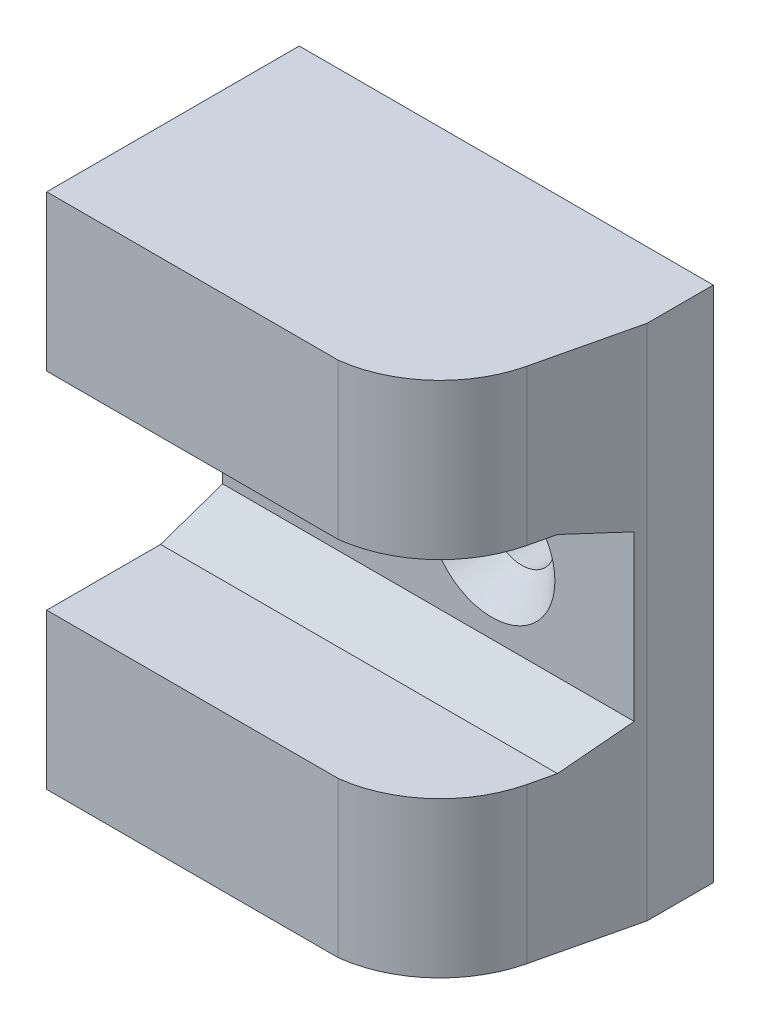
ISO-10303-21;
HEADER;
FILE_DESCRIPTION(('STEP AP214'),'2;1');
FILE_NAME('part.step','',(''),(''),'','','');
FILE_SCHEMA(('AUTOMOTIVE_DESIGN { 1 0 10303 214 1 1 1 1 }'));
ENDSEC;
DATA;
#1=APPLICATION_CONTEXT('core data for automotive mechanical design processes');
#2=APPLICATION_PROTOCOL_DEFINITION('international standard','automotive_design',2000,#1);
#3=PRODUCT_CONTEXT('',#1,'mechanical');
#4=PRODUCT('Part','Part','',(#3));
#5=PRODUCT_RELATED_PRODUCT_CATEGORY('part','',(#4));
#6=PRODUCT_DEFINITION_FORMATION('','',#4);
#7=PRODUCT_DEFINITION_CONTEXT('part definition',#1,'design');
#8=PRODUCT_DEFINITION('design','',#6,#7);
#9=PRODUCT_DEFINITION_SHAPE('','',#8);
#10=(LENGTH_UNIT() NAMED_UNIT(*) SI_UNIT(.MILLI.,.METRE.));
#11=(NAMED_UNIT(*) PLANE_ANGLE_UNIT() SI_UNIT($,.RADIAN.));
#12=(NAMED_UNIT(*) SI_UNIT($,.STERADIAN.) SOLID_ANGLE_UNIT());
#13=UNCERTAINTY_MEASURE_WITH_UNIT(LENGTH_MEASURE(1.E-05),#10,'distance_accuracy_value','');
#14=(GEOMETRIC_REPRESENTATION_CONTEXT(3) GLOBAL_UNCERTAINTY_ASSIGNED_CONTEXT((#13)) GLOBAL_UNIT_ASSIGNED_CONTEXT((#10,
#11,#12)) REPRESENTATION_CONTEXT('',''));
#15=CARTESIAN_POINT('',(0.,0.,0.));
#16=DIRECTION('',(0.,0.,1.));
#17=DIRECTION('',(1.,0.,0.));
#18=AXIS2_PLACEMENT_3D('',#15,#16,#17);
#19=CARTESIAN_POINT('',(0.,0.,12.2));
#20=DIRECTION('',(0.,0.,1.));
#21=DIRECTION('',(1.,0.,0.));
#22=AXIS2_PLACEMENT_3D('',#19,#20,#21);
#23=PLANE('',#22);
#24=DIRECTION('',(1.,0.,0.));
#25=VECTOR('',#24,1.);
#26=CARTESIAN_POINT('',(107.,87.4999999999999,12.2));
#27=LINE('',#26,#25);
#28=CARTESIAN_POINT('',(107.,87.4999999999999,12.2));
#29=VERTEX_POINT('',#28);
#30=CARTESIAN_POINT('',(121.083012975501,87.4999999999999,12.2));
#31=VERTEX_POINT('',#30);
#32=EDGE_CURVE('E153',#29,#31,#27,.T.);
#33=ORIENTED_EDGE('',*,*,#32,.F.);
#34=DIRECTION('',(0.,-1.,0.));
#35=VECTOR('',#34,1.);
#36=CARTESIAN_POINT('',(107.,79.9999999999999,12.2));
#37=LINE('',#36,#35);
#38=CARTESIAN_POINT('',(107.,79.9999999999999,12.2));
#39=VERTEX_POINT('',#38);
#40=EDGE_CURVE('E161',#29,#39,#37,.T.);
#41=ORIENTED_EDGE('',*,*,#40,.T.);
#42=DIRECTION('',(1.,0.,0.));
#43=VECTOR('',#42,1.);
#44=CARTESIAN_POINT('',(127.,79.9999999999999,12.2));
#45=LINE('',#44,#43);
#46=CARTESIAN_POINT('',(121.083012975501,79.9999999999999,12.2));
#47=VERTEX_POINT('',#46);
#48=EDGE_CURVE('E160',#39,#47,#45,.T.);
#49=ORIENTED_EDGE('',*,*,#48,.T.);
#50=DIRECTION('',(0.,1.,0.));
#51=VECTOR('',#50,1.);
#52=CARTESIAN_POINT('',(121.083012975501,78.5000000000001,12.2));
#53=LINE('',#52,#51);
#54=EDGE_CURVE('E188',#31,#47,#53,.F.);
#55=ORIENTED_EDGE('',*,*,#54,.F.);
#56=EDGE_LOOP('',(#33,#41,#49,#55));
#57=FACE_BOUND('',#56,.T.);
#58=ADVANCED_FACE('F37',(#57),#23,.T.);
#59=CARTESIAN_POINT('',(120.4,78.5000000000001,6.6));
#60=DIRECTION('',(0.,1.,0.));
#61=DIRECTION('',(-1.,0.,0.));
#62=AXIS2_PLACEMENT_3D('',#59,#60,#61);
#63=CYLINDRICAL_SURFACE('',#62,5.6414986240097);
#64=DIRECTION('',(0.,1.,0.));
#65=VECTOR('',#64,1.);
#66=CARTESIAN_POINT('',(125.890619014075,78.5000000000001,7.89599751812158));
#67=LINE('',#66,#65);
#68=CARTESIAN_POINT('',(125.890619014075,79.9999999999999,7.89599751812158));
#69=VERTEX_POINT('',#68);
#70=CARTESIAN_POINT('',(125.890619014075,87.4999999999999,7.89599751812158));
#71=VERTEX_POINT('',#70);
#72=EDGE_CURVE('E233',#69,#71,#67,.T.);
#73=ORIENTED_EDGE('',*,*,#72,.T.);
#74=CARTESIAN_POINT('',(120.4,87.4999999999999,6.6));
#75=DIRECTION('',(0.,-1.,0.));
#76=DIRECTION('',(0.,0.,-1.));
#77=AXIS2_PLACEMENT_3D('',#74,#75,#76);
#78=CIRCLE('',#77,5.6414986240097);
#79=EDGE_CURVE('E195',#71,#31,#78,.T.);
#80=ORIENTED_EDGE('',*,*,#79,.T.);
#81=ORIENTED_EDGE('',*,*,#54,.T.);
#82=CARTESIAN_POINT('',(120.4,79.9999999999999,6.6));
#83=DIRECTION('',(0.,1.,0.));
#84=DIRECTION('',(0.,0.,1.));
#85=AXIS2_PLACEMENT_3D('',#82,#83,#84);
#86=CIRCLE('',#85,5.6414986240097);
#87=EDGE_CURVE('E173',#69,#47,#86,.F.);
#88=ORIENTED_EDGE('',*,*,#87,.F.);
#89=EDGE_LOOP('',(#73,#80,#81,#88));
#90=FACE_BOUND('',#89,.T.);
#91=ADVANCED_FACE('F311',(#90),#63,.T.);
#92=CARTESIAN_POINT('',(127.,79.9999999999999,12.2));
#93=DIRECTION('',(-1.,0.,0.));
#94=DIRECTION('',(0.,0.,1.));
#95=AXIS2_PLACEMENT_3D('',#92,#93,#94);
#96=PLANE('',#95);
#97=DIRECTION('',(0.,0.,-1.));
#98=VECTOR('',#97,1.);
#99=CARTESIAN_POINT('',(127.,105.,12.2));
#100=LINE('',#99,#98);
#101=CARTESIAN_POINT('',(127.,105.,3.19599751812158));
#102=VERTEX_POINT('',#101);
#103=CARTESIAN_POINT('',(127.,105.,0.));
#104=VERTEX_POINT('',#103);
#105=EDGE_CURVE('E186',#102,#104,#100,.T.);
#106=ORIENTED_EDGE('',*,*,#105,.F.);
#107=DIRECTION('',(0.,1.,0.));
#108=VECTOR('',#107,1.);
#109=CARTESIAN_POINT('',(127.,78.5000000000001,3.19599751812158));
#110=LINE('',#109,#108);
#111=CARTESIAN_POINT('',(127.,79.9999999999999,3.19599751812158));
#112=VERTEX_POINT('',#111);
#113=EDGE_CURVE('E234',#112,#102,#110,.T.);
#114=ORIENTED_EDGE('',*,*,#113,.F.);
#115=DIRECTION('',(0.,0.,-1.));
#116=VECTOR('',#115,1.);
#117=CARTESIAN_POINT('',(127.,79.9999999999999,12.2));
#118=LINE('',#117,#116);
#119=CARTESIAN_POINT('',(127.,79.9999999999999,0.));
#120=VERTEX_POINT('',#119);
#121=EDGE_CURVE('E164',#112,#120,#118,.T.);
#122=ORIENTED_EDGE('',*,*,#121,.T.);
#123=DIRECTION('',(0.,1.,0.));
#124=VECTOR('',#123,1.);
#125=CARTESIAN_POINT('',(127.,79.9999999999999,0.));
#126=LINE('',#125,#124);
#127=EDGE_CURVE('E169',#120,#104,#126,.T.);
#128=ORIENTED_EDGE('',*,*,#127,.T.);
#129=EDGE_LOOP('',(#106,#114,#122,#128));
#130=FACE_BOUND('',#129,.T.);
#131=ADVANCED_FACE('F259',(#130),#96,.F.);
#132=CARTESIAN_POINT('',(127.,105.,12.2));
#133=DIRECTION('',(0.,-1.,0.));
#134=DIRECTION('',(1.,0.,0.));
#135=AXIS2_PLACEMENT_3D('',#132,#133,#134);
#136=PLANE('',#135);
#137=DIRECTION('',(-1.,0.,0.));
#138=VECTOR('',#137,1.);
#139=CARTESIAN_POINT('',(127.,105.,12.2));
#140=LINE('',#139,#138);
#141=CARTESIAN_POINT('',(121.083012975501,105.,12.2));
#142=VERTEX_POINT('',#141);
#143=CARTESIAN_POINT('',(107.,105.,12.2));
#144=VERTEX_POINT('',#143);
#145=EDGE_CURVE('E158',#142,#144,#140,.T.);
#146=ORIENTED_EDGE('',*,*,#145,.F.);
#147=CARTESIAN_POINT('',(120.4,105.,6.6));
#148=DIRECTION('',(0.,-1.,0.));
#149=DIRECTION('',(-1.,0.,0.));
#150=AXIS2_PLACEMENT_3D('',#147,#148,#149);
#151=CIRCLE('',#150,5.6414986240097);
#152=CARTESIAN_POINT('',(125.890619014075,105.,7.89599751812158));
#153=VERTEX_POINT('',#152);
#154=EDGE_CURVE('E263',#153,#142,#151,.T.);
#155=ORIENTED_EDGE('',*,*,#154,.F.);
#156=DIRECTION('',(-0.229725752764686,0.,0.973255402510923));
#157=VECTOR('',#156,1.);
#158=CARTESIAN_POINT('',(125.890619014075,105.,7.89599751812158));
#159=LINE('',#158,#157);
#160=EDGE_CURVE('E231',#102,#153,#159,.T.);
#161=ORIENTED_EDGE('',*,*,#160,.F.);
#162=ORIENTED_EDGE('',*,*,#105,.T.);
#163=DIRECTION('',(-1.,0.,0.));
#164=VECTOR('',#163,1.);
#165=CARTESIAN_POINT('',(127.,105.,0.));
#166=LINE('',#165,#164);
#167=CARTESIAN_POINT('',(107.,105.,0.));
#168=VERTEX_POINT('',#167);
#169=EDGE_CURVE('E172',#104,#168,#166,.T.);
#170=ORIENTED_EDGE('',*,*,#169,.T.);
#171=DIRECTION('',(0.,0.,-1.));
#172=VECTOR('',#171,1.);
#173=CARTESIAN_POINT('',(107.,105.,12.2));
#174=LINE('',#173,#172);
#175=EDGE_CURVE('E184',#144,#168,#174,.T.);
#176=ORIENTED_EDGE('',*,*,#175,.F.);
#177=EDGE_LOOP('',(#146,#155,#161,#162,#170,#176));
#178=FACE_BOUND('',#177,.T.);
#179=ADVANCED_FACE('F262',(#178),#136,.F.);
#180=CARTESIAN_POINT('',(107.,79.9999999999999,12.2));
#181=DIRECTION('',(1.,0.,0.));
#182=DIRECTION('',(0.,0.,-1.));
#183=AXIS2_PLACEMENT_3D('',#180,#181,#182);
#184=PLANE('',#183);
#185=ORIENTED_EDGE('',*,*,#40,.F.);
#186=DIRECTION('',(0.,0.,1.));
#187=VECTOR('',#186,1.);
#188=CARTESIAN_POINT('',(107.,87.4999999999999,3.7));
#189=LINE('',#188,#187);
#190=CARTESIAN_POINT('',(107.,87.4999999999999,6.69999999999996));
#191=VERTEX_POINT('',#190);
#192=EDGE_CURVE('E142',#191,#29,#189,.T.);
#193=ORIENTED_EDGE('',*,*,#192,.F.);
#194=DIRECTION('',(0.,0.32556815445716,-0.945518575599316));
#195=VECTOR('',#194,1.);
#196=CARTESIAN_POINT('',(107.,85.0119712688795,13.9257601048897));
#197=LINE('',#196,#195);
#198=CARTESIAN_POINT('',(107.,88.5329828398689,3.7));
#199=VERTEX_POINT('',#198);
#200=EDGE_CURVE('E11',#191,#199,#197,.T.);
#201=ORIENTED_EDGE('',*,*,#200,.T.);
#202=DIRECTION('',(0.,-1.,0.));
#203=VECTOR('',#202,1.);
#204=CARTESIAN_POINT('',(107.,97.4999999999999,3.7));
#205=LINE('',#204,#203);
#206=CARTESIAN_POINT('',(107.,96.4670171601309,3.7));
#207=VERTEX_POINT('',#206);
#208=EDGE_CURVE('E143',#207,#199,#205,.T.);
#209=ORIENTED_EDGE('',*,*,#208,.F.);
#210=DIRECTION('',(0.,0.32556815445716,0.945518575599316));
#211=VECTOR('',#210,1.);
#212=CARTESIAN_POINT('',(107.,97.3381631512042,6.2299916633189));
#213=LINE('',#212,#211);
#214=CARTESIAN_POINT('',(107.,97.4999999999999,6.69999999999996));
#215=VERTEX_POINT('',#214);
#216=EDGE_CURVE('E139',#207,#215,#213,.T.);
#217=ORIENTED_EDGE('',*,*,#216,.T.);
#218=DIRECTION('',(0.,0.,1.));
#219=VECTOR('',#218,1.);
#220=CARTESIAN_POINT('',(107.,97.4999999999999,3.7));
#221=LINE('',#220,#219);
#222=CARTESIAN_POINT('',(107.,97.4999999999999,12.2));
#223=VERTEX_POINT('',#222);
#224=EDGE_CURVE('E131',#215,#223,#221,.T.);
#225=ORIENTED_EDGE('',*,*,#224,.T.);
#226=EDGE_CURVE('E137',#144,#223,#37,.T.);
#227=ORIENTED_EDGE('',*,*,#226,.F.);
#228=ORIENTED_EDGE('',*,*,#175,.T.);
#229=DIRECTION('',(0.,-1.,0.));
#230=VECTOR('',#229,1.);
#231=CARTESIAN_POINT('',(107.,79.9999999999999,0.));
#232=LINE('',#231,#230);
#233=CARTESIAN_POINT('',(107.,79.9999999999999,0.));
#234=VERTEX_POINT('',#233);
#235=EDGE_CURVE('E175',#168,#234,#232,.T.);
#236=ORIENTED_EDGE('',*,*,#235,.T.);
#237=DIRECTION('',(0.,0.,-1.));
#238=VECTOR('',#237,1.);
#239=CARTESIAN_POINT('',(107.,79.9999999999999,12.2));
#240=LINE('',#239,#238);
#241=EDGE_CURVE('E181',#39,#234,#240,.T.);
#242=ORIENTED_EDGE('',*,*,#241,.F.);
#243=EDGE_LOOP('',(#185,#193,#201,#209,#217,#225,#227,#228,#236,#242));
#244=FACE_BOUND('',#243,.T.);
#245=ADVANCED_FACE('F134',(#244),#184,.F.);
#246=CARTESIAN_POINT('',(127.,79.9999999999999,12.2));
#247=DIRECTION('',(0.,1.,0.));
#248=DIRECTION('',(0.,0.,1.));
#249=AXIS2_PLACEMENT_3D('',#246,#247,#248);
#250=PLANE('',#249);
#251=DIRECTION('',(-0.229725752764686,0.,0.973255402510923));
#252=VECTOR('',#251,1.);
#253=CARTESIAN_POINT('',(124.98686864801,79.9999999999999,11.7248234799859));
#254=LINE('',#253,#252);
#255=EDGE_CURVE('E191',#112,#69,#254,.T.);
#256=ORIENTED_EDGE('',*,*,#255,.T.);
#257=ORIENTED_EDGE('',*,*,#87,.T.);
#258=ORIENTED_EDGE('',*,*,#48,.F.);
#259=ORIENTED_EDGE('',*,*,#241,.T.);
#260=DIRECTION('',(1.,0.,0.));
#261=VECTOR('',#260,1.);
#262=CARTESIAN_POINT('',(127.,79.9999999999999,0.));
#263=LINE('',#262,#261);
#264=EDGE_CURVE('E177',#234,#120,#263,.T.);
#265=ORIENTED_EDGE('',*,*,#264,.T.);
#266=ORIENTED_EDGE('',*,*,#121,.F.);
#267=EDGE_LOOP('',(#256,#257,#258,#259,#265,#266));
#268=FACE_BOUND('',#267,.T.);
#269=ADVANCED_FACE('F243',(#268),#250,.F.);
#270=DIRECTION('',(-1.,0.,0.));
#271=VECTOR('',#270,1.);
#272=CARTESIAN_POINT('',(107.,97.4999999999999,12.2));
#273=LINE('',#272,#271);
#274=CARTESIAN_POINT('',(121.083012975501,97.4999999999999,12.2));
#275=VERTEX_POINT('',#274);
#276=EDGE_CURVE('E146',#275,#223,#273,.T.);
#277=ORIENTED_EDGE('',*,*,#276,.F.);
#278=EDGE_CURVE('E189',#142,#275,#53,.F.);
#279=ORIENTED_EDGE('',*,*,#278,.F.);
#280=ORIENTED_EDGE('',*,*,#145,.T.);
#281=ORIENTED_EDGE('',*,*,#226,.T.);
#282=EDGE_LOOP('',(#277,#279,#280,#281));
#283=FACE_BOUND('',#282,.T.);
#284=ADVANCED_FACE('F156',(#283),#23,.T.);
#285=CARTESIAN_POINT('',(0.,0.,0.));
#286=DIRECTION('',(0.,0.,1.));
#287=DIRECTION('',(1.,0.,0.));
#288=AXIS2_PLACEMENT_3D('',#285,#286,#287);
#289=PLANE('',#288);
#290=CARTESIAN_POINT('',(112.,92.4999999999999,0.));
#291=DIRECTION('',(0.,0.,1.));
#292=DIRECTION('',(1.,0.,0.));
#293=AXIS2_PLACEMENT_3D('',#290,#291,#292);
#294=CIRCLE('',#293,1.6);
#295=CARTESIAN_POINT('',(113.6,92.4999999999999,0.));
#296=VERTEX_POINT('',#295);
#297=EDGE_CURVE('E277',#296,#296,#294,.T.);
#298=ORIENTED_EDGE('',*,*,#297,.T.);
#299=EDGE_LOOP('',(#298));
#300=FACE_BOUND('',#299,.T.);
#301=CARTESIAN_POINT('',(120.,92.4999999999999,0.));
#302=DIRECTION('',(0.,0.,1.));
#303=DIRECTION('',(1.,0.,0.));
#304=AXIS2_PLACEMENT_3D('',#301,#302,#303);
#305=CIRCLE('',#304,1.6);
#306=CARTESIAN_POINT('',(121.6,92.4999999999999,0.));
#307=VERTEX_POINT('',#306);
#308=EDGE_CURVE('E154',#307,#307,#305,.T.);
#309=ORIENTED_EDGE('',*,*,#308,.T.);
#310=EDGE_LOOP('',(#309));
#311=FACE_BOUND('',#310,.T.);
#312=ORIENTED_EDGE('',*,*,#127,.F.);
#313=ORIENTED_EDGE('',*,*,#264,.F.);
#314=ORIENTED_EDGE('',*,*,#235,.F.);
#315=ORIENTED_EDGE('',*,*,#169,.F.);
#316=EDGE_LOOP('',(#312,#313,#314,#315));
#317=FACE_BOUND('',#316,.T.);
#318=ADVANCED_FACE('F255',(#300,#311,#317),#289,.F.);
#319=CARTESIAN_POINT('',(125.890619014075,78.5000000000001,7.89599751812158));
#320=DIRECTION('',(-0.973255402510923,0.,-0.229725752764686));
#321=DIRECTION('',(-0.229725752764686,0.,0.973255402510923));
#322=AXIS2_PLACEMENT_3D('',#319,#320,#321);
#323=PLANE('',#322);
#324=DIRECTION('',(0.,1.,0.));
#325=VECTOR('',#324,1.);
#326=CARTESIAN_POINT('',(126.881036006329,78.5000000000001,3.7));
#327=LINE('',#326,#325);
#328=CARTESIAN_POINT('',(126.881036006329,88.5329828398689,3.7));
#329=VERTEX_POINT('',#328);
#330=CARTESIAN_POINT('',(126.881036006329,96.4670171601309,3.7));
#331=VERTEX_POINT('',#330);
#332=EDGE_CURVE('E198',#329,#331,#327,.T.);
#333=ORIENTED_EDGE('',*,*,#332,.F.);
#334=DIRECTION('',(-0.217820036497905,-0.317750921418551,0.922815682375258));
#335=VECTOR('',#334,1.);
#336=CARTESIAN_POINT('',(125.296209109169,86.2210733619439,10.4142726539915));
#337=LINE('',#336,#335);
#338=CARTESIAN_POINT('',(126.172920483398,87.4999999999999,6.69999999999996));
#339=VERTEX_POINT('',#338);
#340=EDGE_CURVE('E46',#329,#339,#337,.T.);
#341=ORIENTED_EDGE('',*,*,#340,.T.);
#342=DIRECTION('',(-0.229725752764686,0.,0.973255402510923));
#343=VECTOR('',#342,1.);
#344=CARTESIAN_POINT('',(125.890619014075,87.4999999999999,7.89599751812157));
#345=LINE('',#344,#343);
#346=EDGE_CURVE('E224',#339,#71,#345,.T.);
#347=ORIENTED_EDGE('',*,*,#346,.T.);
#348=ORIENTED_EDGE('',*,*,#72,.F.);
#349=ORIENTED_EDGE('',*,*,#255,.F.);
#350=ORIENTED_EDGE('',*,*,#113,.T.);
#351=ORIENTED_EDGE('',*,*,#160,.T.);
#352=CARTESIAN_POINT('',(125.890619014075,97.4999999999999,7.89599751812158));
#353=VERTEX_POINT('',#352);
#354=EDGE_CURVE('E228',#353,#153,#67,.T.);
#355=ORIENTED_EDGE('',*,*,#354,.F.);
#356=DIRECTION('',(0.229725752764686,0.,-0.973255402510923));
#357=VECTOR('',#356,1.);
#358=CARTESIAN_POINT('',(125.890619014075,97.4999999999999,7.89599751812156));
#359=LINE('',#358,#357);
#360=CARTESIAN_POINT('',(126.172920483398,97.4999999999999,6.69999999999996));
#361=VERTEX_POINT('',#360);
#362=EDGE_CURVE('E216',#353,#361,#359,.T.);
#363=ORIENTED_EDGE('',*,*,#362,.T.);
#364=DIRECTION('',(0.217820036497907,-0.31775092141855,-0.922815682375258));
#365=VECTOR('',#364,1.);
#366=CARTESIAN_POINT('',(127.234159593586,95.9518884923105,2.20395771951323));
#367=LINE('',#366,#365);
#368=EDGE_CURVE('E211',#361,#331,#367,.T.);
#369=ORIENTED_EDGE('',*,*,#368,.T.);
#370=EDGE_LOOP('',(#333,#341,#347,#348,#349,#350,#351,#355,#363,#369));
#371=FACE_BOUND('',#370,.T.);
#372=ADVANCED_FACE('F214',(#371),#323,.F.);
#373=ORIENTED_EDGE('',*,*,#278,.T.);
#374=CARTESIAN_POINT('',(120.4,97.4999999999999,6.6));
#375=DIRECTION('',(0.,1.,0.));
#376=DIRECTION('',(0.,0.,1.));
#377=AXIS2_PLACEMENT_3D('',#374,#375,#376);
#378=CIRCLE('',#377,5.6414986240097);
#379=EDGE_CURVE('E149',#275,#353,#378,.T.);
#380=ORIENTED_EDGE('',*,*,#379,.T.);
#381=ORIENTED_EDGE('',*,*,#354,.T.);
#382=ORIENTED_EDGE('',*,*,#154,.T.);
#383=EDGE_LOOP('',(#373,#380,#381,#382));
#384=FACE_BOUND('',#383,.T.);
#385=ADVANCED_FACE('F227',(#384),#63,.T.);
#386=CARTESIAN_POINT('',(0.,0.,3.7));
#387=DIRECTION('',(0.,0.,1.));
#388=DIRECTION('',(1.,0.,0.));
#389=AXIS2_PLACEMENT_3D('',#386,#387,#388);
#390=PLANE('',#389);
#391=CARTESIAN_POINT('',(112.,92.4999999999999,3.7));
#392=DIRECTION('',(0.,0.,1.));
#393=DIRECTION('',(1.,0.,0.));
#394=AXIS2_PLACEMENT_3D('',#391,#392,#393);
#395=CIRCLE('',#394,3.05);
#396=CARTESIAN_POINT('',(115.05,92.4999999999999,3.7));
#397=VERTEX_POINT('',#396);
#398=EDGE_CURVE('E283',#397,#397,#395,.T.);
#399=ORIENTED_EDGE('',*,*,#398,.F.);
#400=EDGE_LOOP('',(#399));
#401=FACE_BOUND('',#400,.T.);
#402=CARTESIAN_POINT('',(120.,92.4999999999999,3.7));
#403=DIRECTION('',(0.,0.,1.));
#404=DIRECTION('',(1.,0.,0.));
#405=AXIS2_PLACEMENT_3D('',#402,#403,#404);
#406=CIRCLE('',#405,3.05);
#407=CARTESIAN_POINT('',(123.05,92.4999999999999,3.7));
#408=VERTEX_POINT('',#407);
#409=EDGE_CURVE('E274',#408,#408,#406,.T.);
#410=ORIENTED_EDGE('',*,*,#409,.F.);
#411=EDGE_LOOP('',(#410));
#412=FACE_BOUND('',#411,.T.);
#413=ORIENTED_EDGE('',*,*,#332,.T.);
#414=DIRECTION('',(-1.,0.,0.));
#415=VECTOR('',#414,1.);
#416=CARTESIAN_POINT('',(0.,96.4670171601309,3.7));
#417=LINE('',#416,#415);
#418=EDGE_CURVE('E204',#331,#207,#417,.T.);
#419=ORIENTED_EDGE('',*,*,#418,.T.);
#420=ORIENTED_EDGE('',*,*,#208,.T.);
#421=DIRECTION('',(1.,0.,0.));
#422=VECTOR('',#421,1.);
#423=CARTESIAN_POINT('',(0.,88.5329828398689,3.7));
#424=LINE('',#423,#422);
#425=EDGE_CURVE('E201',#199,#329,#424,.T.);
#426=ORIENTED_EDGE('',*,*,#425,.T.);
#427=EDGE_LOOP('',(#413,#419,#420,#426));
#428=FACE_BOUND('',#427,.T.);
#429=ADVANCED_FACE('F220',(#401,#412,#428),#390,.T.);
#430=CARTESIAN_POINT('',(107.,87.4999999999999,3.7));
#431=DIRECTION('',(0.,-1.,0.));
#432=DIRECTION('',(0.,0.,-1.));
#433=AXIS2_PLACEMENT_3D('',#430,#431,#432);
#434=PLANE('',#433);
#435=ORIENTED_EDGE('',*,*,#346,.F.);
#436=DIRECTION('',(-1.,0.,0.));
#437=VECTOR('',#436,1.);
#438=CARTESIAN_POINT('',(107.,87.4999999999999,6.69999999999996));
#439=LINE('',#438,#437);
#440=EDGE_CURVE('E59',#339,#191,#439,.T.);
#441=ORIENTED_EDGE('',*,*,#440,.T.);
#442=ORIENTED_EDGE('',*,*,#192,.T.);
#443=ORIENTED_EDGE('',*,*,#32,.T.);
#444=ORIENTED_EDGE('',*,*,#79,.F.);
#445=EDGE_LOOP('',(#435,#441,#442,#443,#444));
#446=FACE_BOUND('',#445,.T.);
#447=ADVANCED_FACE('F291',(#446),#434,.F.);
#448=CARTESIAN_POINT('',(107.,97.4999999999999,3.7));
#449=DIRECTION('',(0.,1.,0.));
#450=DIRECTION('',(0.,0.,1.));
#451=AXIS2_PLACEMENT_3D('',#448,#449,#450);
#452=PLANE('',#451);
#453=ORIENTED_EDGE('',*,*,#224,.F.);
#454=DIRECTION('',(1.,0.,0.));
#455=VECTOR('',#454,1.);
#456=CARTESIAN_POINT('',(107.,97.4999999999999,6.69999999999996));
#457=LINE('',#456,#455);
#458=EDGE_CURVE('E207',#215,#361,#457,.T.);
#459=ORIENTED_EDGE('',*,*,#458,.T.);
#460=ORIENTED_EDGE('',*,*,#362,.F.);
#461=ORIENTED_EDGE('',*,*,#379,.F.);
#462=ORIENTED_EDGE('',*,*,#276,.T.);
#463=EDGE_LOOP('',(#453,#459,#460,#461,#462));
#464=FACE_BOUND('',#463,.T.);
#465=ADVANCED_FACE('F147',(#464),#452,.F.);
#466=CARTESIAN_POINT('',(120.,92.4999999999999,3.7));
#467=DIRECTION('',(0.,0.,1.));
#468=DIRECTION('',(1.,0.,0.));
#469=AXIS2_PLACEMENT_3D('',#466,#467,#468);
#470=CYLINDRICAL_SURFACE('',#469,1.6);
#471=ORIENTED_EDGE('',*,*,#308,.F.);
#472=EDGE_LOOP('',(#471));
#473=FACE_BOUND('',#472,.T.);
#474=CARTESIAN_POINT('',(120.,92.4999999999999,2.25));
#475=DIRECTION('',(0.,0.,1.));
#476=DIRECTION('',(1.,0.,0.));
#477=AXIS2_PLACEMENT_3D('',#474,#475,#476);
#478=CIRCLE('',#477,1.6);
#479=CARTESIAN_POINT('',(121.6,92.4999999999999,2.25));
#480=VERTEX_POINT('',#479);
#481=EDGE_CURVE('E271',#480,#480,#478,.T.);
#482=ORIENTED_EDGE('',*,*,#481,.T.);
#483=EDGE_LOOP('',(#482));
#484=FACE_BOUND('',#483,.T.);
#485=ADVANCED_FACE('F298',(#473,#484),#470,.F.);
#486=CARTESIAN_POINT('',(120.,92.4999999999999,3.7));
#487=DIRECTION('',(0.,0.,1.));
#488=DIRECTION('',(1.,0.,0.));
#489=AXIS2_PLACEMENT_3D('',#486,#487,#488);
#490=CONICAL_SURFACE('',#489,3.05,0.785398163397446);
#491=ORIENTED_EDGE('',*,*,#481,.F.);
#492=EDGE_LOOP('',(#491));
#493=FACE_BOUND('',#492,.T.);
#494=ORIENTED_EDGE('',*,*,#409,.T.);
#495=EDGE_LOOP('',(#494));
#496=FACE_BOUND('',#495,.T.);
#497=ADVANCED_FACE('F295',(#493,#496),#490,.F.);
#498=CARTESIAN_POINT('',(112.,92.4999999999999,3.7));
#499=DIRECTION('',(0.,0.,1.));
#500=DIRECTION('',(1.,0.,0.));
#501=AXIS2_PLACEMENT_3D('',#498,#499,#500);
#502=CYLINDRICAL_SURFACE('',#501,1.6);
#503=ORIENTED_EDGE('',*,*,#297,.F.);
#504=EDGE_LOOP('',(#503));
#505=FACE_BOUND('',#504,.T.);
#506=CARTESIAN_POINT('',(112.,92.4999999999999,2.25));
#507=DIRECTION('',(0.,0.,1.));
#508=DIRECTION('',(1.,0.,0.));
#509=AXIS2_PLACEMENT_3D('',#506,#507,#508);
#510=CIRCLE('',#509,1.6);
#511=CARTESIAN_POINT('',(113.6,92.4999999999999,2.25));
#512=VERTEX_POINT('',#511);
#513=EDGE_CURVE('E280',#512,#512,#510,.T.);
#514=ORIENTED_EDGE('',*,*,#513,.T.);
#515=EDGE_LOOP('',(#514));
#516=FACE_BOUND('',#515,.T.);
#517=ADVANCED_FACE('F297',(#505,#516),#502,.F.);
#518=CARTESIAN_POINT('',(112.,92.4999999999999,3.7));
#519=DIRECTION('',(0.,0.,1.));
#520=DIRECTION('',(1.,0.,0.));
#521=AXIS2_PLACEMENT_3D('',#518,#519,#520);
#522=CONICAL_SURFACE('',#521,3.05,0.785398163397446);
#523=ORIENTED_EDGE('',*,*,#513,.F.);
#524=EDGE_LOOP('',(#523));
#525=FACE_BOUND('',#524,.T.);
#526=ORIENTED_EDGE('',*,*,#398,.T.);
#527=EDGE_LOOP('',(#526));
#528=FACE_BOUND('',#527,.T.);
#529=ADVANCED_FACE('F287',(#525,#528),#522,.F.);
#530=CARTESIAN_POINT('',(0.,96.4670171601309,3.7));
#531=DIRECTION('',(0.,0.945518575599316,-0.32556815445716));
#532=DIRECTION('',(-1.,0.,0.));
#533=AXIS2_PLACEMENT_3D('',#530,#531,#532);
#534=PLANE('',#533);
#535=ORIENTED_EDGE('',*,*,#368,.F.);
#536=ORIENTED_EDGE('',*,*,#458,.F.);
#537=ORIENTED_EDGE('',*,*,#216,.F.);
#538=ORIENTED_EDGE('',*,*,#418,.F.);
#539=EDGE_LOOP('',(#535,#536,#537,#538));
#540=FACE_BOUND('',#539,.T.);
#541=ADVANCED_FACE('F223',(#540),#534,.F.);
#542=CARTESIAN_POINT('',(0.,88.5329828398689,3.7));
#543=DIRECTION('',(0.,-0.945518575599316,-0.32556815445716));
#544=DIRECTION('',(1.,0.,0.));
#545=AXIS2_PLACEMENT_3D('',#542,#543,#544);
#546=PLANE('',#545);
#547=ORIENTED_EDGE('',*,*,#200,.F.);
#548=ORIENTED_EDGE('',*,*,#440,.F.);
#549=ORIENTED_EDGE('',*,*,#340,.F.);
#550=ORIENTED_EDGE('',*,*,#425,.F.);
#551=EDGE_LOOP('',(#547,#548,#549,#550));
#552=FACE_BOUND('',#551,.T.);
#553=ADVANCED_FACE('F40',(#552),#546,.F.);
#554=CLOSED_SHELL('',(#58,#91,#131,#179,#245,#269,#284,#318,#372,#385,#429,#447,#465,#485,#497,
#517,#529,#541,#553));
#555=MANIFOLD_SOLID_BREP('B2',#554);
#556=ADVANCED_BREP_SHAPE_REPRESENTATION('',(#18,#555),#14);
#557=SHAPE_DEFINITION_REPRESENTATION(#9,#556);
ENDSEC;
END-ISO-10303-21;
